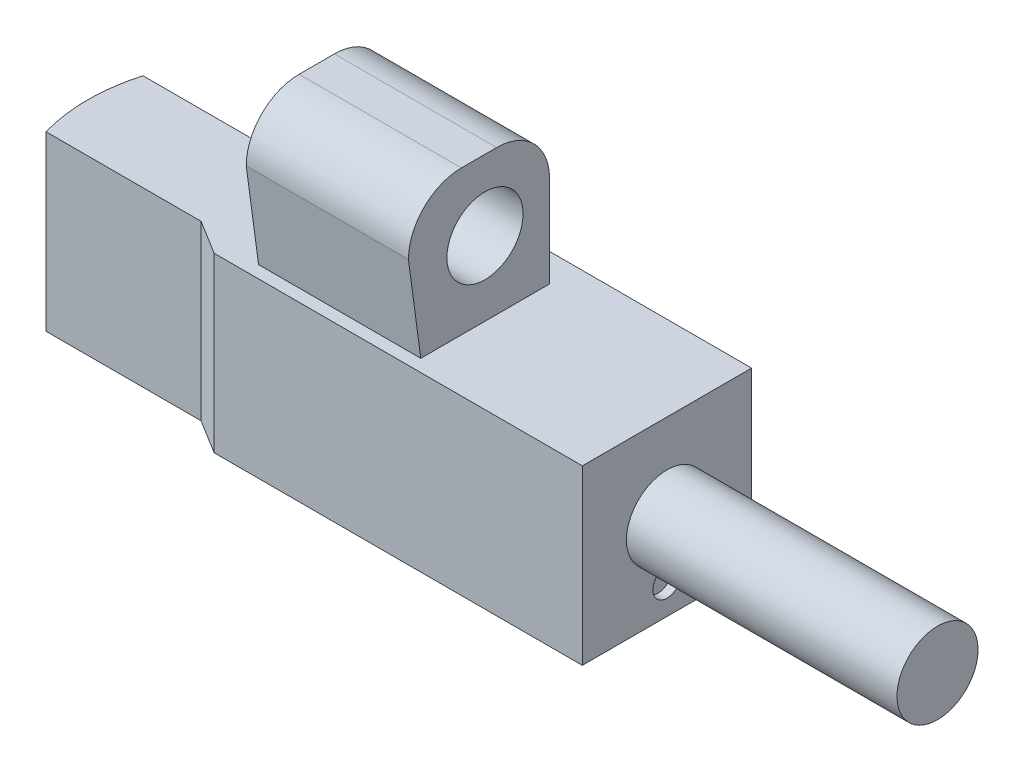
ISO-10303-21;
HEADER;
FILE_DESCRIPTION(('STEP AP214'),'2;1');
FILE_NAME('part.step','',(''),(''),'','','');
FILE_SCHEMA(('AUTOMOTIVE_DESIGN { 1 0 10303 214 1 1 1 1 }'));
ENDSEC;
DATA;
#1=APPLICATION_CONTEXT('core data for automotive mechanical design processes');
#2=APPLICATION_PROTOCOL_DEFINITION('international standard','automotive_design',2000,#1);
#3=PRODUCT_CONTEXT('',#1,'mechanical');
#4=PRODUCT('Part','Part','',(#3));
#5=PRODUCT_RELATED_PRODUCT_CATEGORY('part','',(#4));
#6=PRODUCT_DEFINITION_FORMATION('','',#4);
#7=PRODUCT_DEFINITION_CONTEXT('part definition',#1,'design');
#8=PRODUCT_DEFINITION('design','',#6,#7);
#9=PRODUCT_DEFINITION_SHAPE('','',#8);
#10=(LENGTH_UNIT() NAMED_UNIT(*) SI_UNIT(.MILLI.,.METRE.));
#11=(NAMED_UNIT(*) PLANE_ANGLE_UNIT() SI_UNIT($,.RADIAN.));
#12=(NAMED_UNIT(*) SI_UNIT($,.STERADIAN.) SOLID_ANGLE_UNIT());
#13=UNCERTAINTY_MEASURE_WITH_UNIT(LENGTH_MEASURE(1.E-05),#10,'distance_accuracy_value','');
#14=(GEOMETRIC_REPRESENTATION_CONTEXT(3) GLOBAL_UNCERTAINTY_ASSIGNED_CONTEXT((#13)) GLOBAL_UNIT_ASSIGNED_CONTEXT((#10,
#11,#12)) REPRESENTATION_CONTEXT('',''));
#15=CARTESIAN_POINT('',(0.,0.,0.));
#16=DIRECTION('',(0.,0.,1.));
#17=DIRECTION('',(1.,0.,0.));
#18=AXIS2_PLACEMENT_3D('',#15,#16,#17);
#19=CARTESIAN_POINT('',(7.87,5.95,0.23));
#20=DIRECTION('',(-1.,0.,0.));
#21=DIRECTION('',(0.,0.,1.));
#22=AXIS2_PLACEMENT_3D('',#19,#20,#21);
#23=PLANE('',#22);
#24=CARTESIAN_POINT('',(7.87,4.55,0.23));
#25=DIRECTION('',(-1.,0.,0.));
#26=DIRECTION('',(0.,0.,1.));
#27=AXIS2_PLACEMENT_3D('',#24,#25,#26);
#28=CIRCLE('',#27,1.08);
#29=CARTESIAN_POINT('',(7.87,4.55,1.31));
#30=VERTEX_POINT('',#29);
#31=EDGE_CURVE('E19',#30,#30,#28,.F.);
#32=ORIENTED_EDGE('',*,*,#31,.T.);
#33=EDGE_LOOP('',(#32));
#34=FACE_BOUND('',#33,.T.);
#35=CARTESIAN_POINT('',(7.87,4.55,0.23));
#36=DIRECTION('',(-1.,0.,0.));
#37=DIRECTION('',(0.,0.,1.));
#38=AXIS2_PLACEMENT_3D('',#35,#36,#37);
#39=CIRCLE('',#38,1.4);
#40=CARTESIAN_POINT('',(7.87,4.55,1.63));
#41=VERTEX_POINT('',#40);
#42=EDGE_CURVE('E96',#41,#41,#39,.T.);
#43=ORIENTED_EDGE('',*,*,#42,.T.);
#44=EDGE_LOOP('',(#43));
#45=FACE_BOUND('',#44,.T.);
#46=ADVANCED_FACE('F16',(#34,#45),#23,.T.);
#47=CARTESIAN_POINT('',(11.07,6.55,-0.1));
#48=DIRECTION('',(0.,-1.,0.));
#49=DIRECTION('',(0.,0.,-1.));
#50=AXIS2_PLACEMENT_3D('',#47,#48,#49);
#51=PLANE('',#50);
#52=DIRECTION('',(-1.,0.,0.));
#53=VECTOR('',#52,1.);
#54=CARTESIAN_POINT('',(11.07,6.55,0.9));
#55=LINE('',#54,#53);
#56=CARTESIAN_POINT('',(11.07,6.55,0.899999999999964));
#57=VERTEX_POINT('',#56);
#58=CARTESIAN_POINT('',(6.47,6.55,0.899999999999964));
#59=VERTEX_POINT('',#58);
#60=EDGE_CURVE('E91',#57,#59,#55,.T.);
#61=ORIENTED_EDGE('',*,*,#60,.F.);
#62=DIRECTION('',(0.,0.,-1.));
#63=VECTOR('',#62,1.);
#64=CARTESIAN_POINT('',(11.07,6.55,-0.1));
#65=LINE('',#64,#63);
#66=CARTESIAN_POINT('',(11.07,6.55,-0.0999999999999638));
#67=VERTEX_POINT('',#66);
#68=EDGE_CURVE('E76',#67,#57,#65,.F.);
#69=ORIENTED_EDGE('',*,*,#68,.F.);
#70=DIRECTION('',(-1.,0.,0.));
#71=VECTOR('',#70,1.);
#72=CARTESIAN_POINT('',(11.07,6.55,-0.1));
#73=LINE('',#72,#71);
#74=CARTESIAN_POINT('',(6.47,6.55,-0.0999999999999638));
#75=VERTEX_POINT('',#74);
#76=EDGE_CURVE('E101',#75,#67,#73,.F.);
#77=ORIENTED_EDGE('',*,*,#76,.F.);
#78=DIRECTION('',(0.,0.,-1.));
#79=VECTOR('',#78,1.);
#80=CARTESIAN_POINT('',(6.47,6.55,-0.1));
#81=LINE('',#80,#79);
#82=EDGE_CURVE('E88',#59,#75,#81,.T.);
#83=ORIENTED_EDGE('',*,*,#82,.F.);
#84=EDGE_LOOP('',(#61,#69,#77,#83));
#85=FACE_BOUND('',#84,.T.);
#86=ADVANCED_FACE('F92',(#85),#51,.F.);
#87=CARTESIAN_POINT('',(11.07,4.55,0.23));
#88=DIRECTION('',(-1.,0.,0.));
#89=DIRECTION('',(0.,0.,1.));
#90=AXIS2_PLACEMENT_3D('',#87,#88,#89);
#91=CYLINDRICAL_SURFACE('',#90,1.08);
#92=ORIENTED_EDGE('',*,*,#31,.F.);
#93=EDGE_LOOP('',(#92));
#94=FACE_BOUND('',#93,.T.);
#95=CARTESIAN_POINT('',(11.07,4.55,0.23));
#96=DIRECTION('',(-1.,0.,0.));
#97=DIRECTION('',(0.,0.,1.));
#98=AXIS2_PLACEMENT_3D('',#95,#96,#97);
#99=CIRCLE('',#98,1.08);
#100=CARTESIAN_POINT('',(11.07,4.55,1.31));
#101=VERTEX_POINT('',#100);
#102=EDGE_CURVE('E103',#101,#101,#99,.T.);
#103=ORIENTED_EDGE('',*,*,#102,.F.);
#104=EDGE_LOOP('',(#103));
#105=FACE_BOUND('',#104,.T.);
#106=ADVANCED_FACE('F526',(#94,#105),#91,.F.);
#107=CARTESIAN_POINT('',(11.07,5.04999999999993,0.899999999999929));
#108=DIRECTION('',(-1.,0.,0.));
#109=DIRECTION('',(0.,0.,1.));
#110=AXIS2_PLACEMENT_3D('',#107,#108,#109);
#111=CYLINDRICAL_SURFACE('',#110,1.50000000000007);
#112=CARTESIAN_POINT('',(11.07,5.04999999999993,0.899999999999929));
#113=DIRECTION('',(-1.,0.,0.));
#114=DIRECTION('',(0.,0.,1.));
#115=AXIS2_PLACEMENT_3D('',#112,#113,#114);
#116=CIRCLE('',#115,1.50000000000007);
#117=CARTESIAN_POINT('',(11.07,5.05,2.4));
#118=VERTEX_POINT('',#117);
#119=EDGE_CURVE('E81',#57,#118,#116,.F.);
#120=ORIENTED_EDGE('',*,*,#119,.F.);
#121=ORIENTED_EDGE('',*,*,#60,.T.);
#122=CARTESIAN_POINT('',(6.47,5.04999999999993,0.899999999999929));
#123=DIRECTION('',(-1.,0.,0.));
#124=DIRECTION('',(0.,0.,1.));
#125=AXIS2_PLACEMENT_3D('',#122,#123,#124);
#126=CIRCLE('',#125,1.50000000000007);
#127=CARTESIAN_POINT('',(6.47,5.05,2.4));
#128=VERTEX_POINT('',#127);
#129=EDGE_CURVE('E121',#59,#128,#126,.F.);
#130=ORIENTED_EDGE('',*,*,#129,.T.);
#131=DIRECTION('',(1.,0.,0.));
#132=VECTOR('',#131,1.);
#133=CARTESIAN_POINT('',(11.07,5.05,2.4));
#134=LINE('',#133,#132);
#135=EDGE_CURVE('E100',#128,#118,#134,.T.);
#136=ORIENTED_EDGE('',*,*,#135,.T.);
#137=EDGE_LOOP('',(#120,#121,#130,#136));
#138=FACE_BOUND('',#137,.T.);
#139=ADVANCED_FACE('F99',(#138),#111,.T.);
#140=CARTESIAN_POINT('',(11.07,4.55,0.23));
#141=DIRECTION('',(-1.,0.,0.));
#142=DIRECTION('',(0.,0.,1.));
#143=AXIS2_PLACEMENT_3D('',#140,#141,#142);
#144=CYLINDRICAL_SURFACE('',#143,1.4);
#145=ORIENTED_EDGE('',*,*,#42,.F.);
#146=EDGE_LOOP('',(#145));
#147=FACE_BOUND('',#146,.T.);
#148=CARTESIAN_POINT('',(6.47,4.55,0.23));
#149=DIRECTION('',(-1.,0.,0.));
#150=DIRECTION('',(0.,0.,1.));
#151=AXIS2_PLACEMENT_3D('',#148,#149,#150);
#152=CIRCLE('',#151,1.4);
#153=CARTESIAN_POINT('',(6.47,4.55,1.63));
#154=VERTEX_POINT('',#153);
#155=EDGE_CURVE('E118',#154,#154,#152,.T.);
#156=ORIENTED_EDGE('',*,*,#155,.T.);
#157=EDGE_LOOP('',(#156));
#158=FACE_BOUND('',#157,.T.);
#159=ADVANCED_FACE('F111',(#147,#158),#144,.F.);
#160=CARTESIAN_POINT('',(11.07,5.04999999999993,-0.0999999999999274));
#161=DIRECTION('',(-1.,0.,0.));
#162=DIRECTION('',(0.,0.,1.));
#163=AXIS2_PLACEMENT_3D('',#160,#161,#162);
#164=CYLINDRICAL_SURFACE('',#163,1.50000000000007);
#165=CARTESIAN_POINT('',(11.07,5.04999999999993,-0.0999999999999274));
#166=DIRECTION('',(-1.,0.,0.));
#167=DIRECTION('',(0.,0.,1.));
#168=AXIS2_PLACEMENT_3D('',#165,#166,#167);
#169=CIRCLE('',#168,1.50000000000007);
#170=CARTESIAN_POINT('',(11.07,5.04999999999993,-1.6));
#171=VERTEX_POINT('',#170);
#172=EDGE_CURVE('E84',#171,#67,#169,.F.);
#173=ORIENTED_EDGE('',*,*,#172,.F.);
#174=DIRECTION('',(1.,0.,0.));
#175=VECTOR('',#174,1.);
#176=CARTESIAN_POINT('',(11.07,5.04999999999993,-1.6));
#177=LINE('',#176,#175);
#178=CARTESIAN_POINT('',(6.47,5.04999999999993,-1.6));
#179=VERTEX_POINT('',#178);
#180=EDGE_CURVE('E123',#171,#179,#177,.F.);
#181=ORIENTED_EDGE('',*,*,#180,.T.);
#182=CARTESIAN_POINT('',(6.47,5.04999999999993,-0.0999999999999274));
#183=DIRECTION('',(-1.,0.,0.));
#184=DIRECTION('',(0.,0.,1.));
#185=AXIS2_PLACEMENT_3D('',#182,#183,#184);
#186=CIRCLE('',#185,1.50000000000007);
#187=EDGE_CURVE('E125',#179,#75,#186,.F.);
#188=ORIENTED_EDGE('',*,*,#187,.T.);
#189=ORIENTED_EDGE('',*,*,#76,.T.);
#190=EDGE_LOOP('',(#173,#181,#188,#189));
#191=FACE_BOUND('',#190,.T.);
#192=ADVANCED_FACE('F114',(#191),#164,.T.);
#193=CARTESIAN_POINT('',(15.75,-1.6,0.));
#194=DIRECTION('',(1.,0.,0.));
#195=DIRECTION('',(0.,0.,-1.));
#196=AXIS2_PLACEMENT_3D('',#193,#194,#195);
#197=PLANE('',#196);
#198=CARTESIAN_POINT('',(15.75,-1.6,0.));
#199=DIRECTION('',(1.,0.,0.));
#200=DIRECTION('',(0.,0.,-1.));
#201=AXIS2_PLACEMENT_3D('',#198,#199,#200);
#202=CIRCLE('',#201,0.4);
#203=CARTESIAN_POINT('',(15.75,-1.6,-0.4));
#204=VERTEX_POINT('',#203);
#205=EDGE_CURVE('E128',#204,#204,#202,.T.);
#206=ORIENTED_EDGE('',*,*,#205,.T.);
#207=EDGE_LOOP('',(#206));
#208=FACE_BOUND('',#207,.T.);
#209=ADVANCED_FACE('F497',(#208),#197,.T.);
#210=CARTESIAN_POINT('',(23.6711556437292,1.15,0.));
#211=DIRECTION('',(-1.,0.,0.));
#212=DIRECTION('',(0.,0.,1.));
#213=AXIS2_PLACEMENT_3D('',#210,#211,#212);
#214=PLANE('',#213);
#215=CARTESIAN_POINT('',(23.6711556437292,0.,0.));
#216=DIRECTION('',(-1.,0.,0.));
#217=DIRECTION('',(0.,0.,1.));
#218=AXIS2_PLACEMENT_3D('',#215,#216,#217);
#219=CIRCLE('',#218,1.15);
#220=CARTESIAN_POINT('',(23.6711556437292,0.,1.15));
#221=VERTEX_POINT('',#220);
#222=EDGE_CURVE('E163',#221,#221,#219,.T.);
#223=ORIENTED_EDGE('',*,*,#222,.F.);
#224=EDGE_LOOP('',(#223));
#225=FACE_BOUND('',#224,.T.);
#226=ADVANCED_FACE('F489',(#225),#214,.F.);
#227=CARTESIAN_POINT('',(11.07,5.04999999999993,0.899999999999929));
#228=DIRECTION('',(1.,0.,0.));
#229=DIRECTION('',(0.,0.,-1.));
#230=AXIS2_PLACEMENT_3D('',#227,#228,#229);
#231=PLANE('',#230);
#232=ORIENTED_EDGE('',*,*,#102,.T.);
#233=EDGE_LOOP('',(#232));
#234=FACE_BOUND('',#233,.T.);
#235=ORIENTED_EDGE('',*,*,#172,.T.);
#236=ORIENTED_EDGE('',*,*,#68,.T.);
#237=ORIENTED_EDGE('',*,*,#119,.T.);
#238=DIRECTION('',(0.,0.991060661622863,0.133412012141539));
#239=VECTOR('',#238,1.);
#240=CARTESIAN_POINT('',(11.07,5.05,2.4));
#241=LINE('',#240,#239);
#242=CARTESIAN_POINT('',(11.07,2.45,2.05));
#243=VERTEX_POINT('',#242);
#244=EDGE_CURVE('E136',#118,#243,#241,.F.);
#245=ORIENTED_EDGE('',*,*,#244,.T.);
#246=DIRECTION('',(0.,0.,1.));
#247=VECTOR('',#246,1.);
#248=CARTESIAN_POINT('',(11.07,2.45,0.425));
#249=LINE('',#248,#247);
#250=CARTESIAN_POINT('',(11.07,2.45,-1.6));
#251=VERTEX_POINT('',#250);
#252=EDGE_CURVE('E144',#251,#243,#249,.T.);
#253=ORIENTED_EDGE('',*,*,#252,.F.);
#254=DIRECTION('',(0.,1.,0.));
#255=VECTOR('',#254,1.);
#256=CARTESIAN_POINT('',(11.07,2.45,-1.6));
#257=LINE('',#256,#255);
#258=EDGE_CURVE('E120',#251,#171,#257,.T.);
#259=ORIENTED_EDGE('',*,*,#258,.T.);
#260=EDGE_LOOP('',(#235,#236,#237,#245,#253,#259));
#261=FACE_BOUND('',#260,.T.);
#262=ADVANCED_FACE('F78',(#234,#261),#231,.T.);
#263=CARTESIAN_POINT('',(11.07,5.05,2.4));
#264=DIRECTION('',(0.,0.133412012141539,-0.991060661622863));
#265=DIRECTION('',(0.,0.991060661622863,0.133412012141539));
#266=AXIS2_PLACEMENT_3D('',#263,#264,#265);
#267=PLANE('',#266);
#268=DIRECTION('',(1.,0.,0.));
#269=VECTOR('',#268,1.);
#270=CARTESIAN_POINT('',(4.99999999999997,2.45,2.05));
#271=LINE('',#270,#269);
#272=CARTESIAN_POINT('',(6.47,2.45,2.05));
#273=VERTEX_POINT('',#272);
#274=EDGE_CURVE('E140',#243,#273,#271,.F.);
#275=ORIENTED_EDGE('',*,*,#274,.F.);
#276=ORIENTED_EDGE('',*,*,#244,.F.);
#277=ORIENTED_EDGE('',*,*,#135,.F.);
#278=DIRECTION('',(0.,-0.991060661622862,-0.133412012141539));
#279=VECTOR('',#278,1.);
#280=CARTESIAN_POINT('',(6.47,5.05,2.4));
#281=LINE('',#280,#279);
#282=EDGE_CURVE('E132',#128,#273,#281,.T.);
#283=ORIENTED_EDGE('',*,*,#282,.T.);
#284=EDGE_LOOP('',(#275,#276,#277,#283));
#285=FACE_BOUND('',#284,.T.);
#286=ADVANCED_FACE('F227',(#285),#267,.F.);
#287=CARTESIAN_POINT('',(6.47,5.04999999999993,0.899999999999929));
#288=DIRECTION('',(1.,0.,0.));
#289=DIRECTION('',(0.,0.,-1.));
#290=AXIS2_PLACEMENT_3D('',#287,#288,#289);
#291=PLANE('',#290);
#292=ORIENTED_EDGE('',*,*,#155,.F.);
#293=EDGE_LOOP('',(#292));
#294=FACE_BOUND('',#293,.T.);
#295=ORIENTED_EDGE('',*,*,#82,.T.);
#296=ORIENTED_EDGE('',*,*,#187,.F.);
#297=DIRECTION('',(0.,1.,0.));
#298=VECTOR('',#297,1.);
#299=CARTESIAN_POINT('',(6.47,2.45,-1.6));
#300=LINE('',#299,#298);
#301=CARTESIAN_POINT('',(6.47,2.45,-1.6));
#302=VERTEX_POINT('',#301);
#303=EDGE_CURVE('E174',#179,#302,#300,.F.);
#304=ORIENTED_EDGE('',*,*,#303,.T.);
#305=DIRECTION('',(0.,0.,1.));
#306=VECTOR('',#305,1.);
#307=CARTESIAN_POINT('',(6.47,2.45,0.425));
#308=LINE('',#307,#306);
#309=EDGE_CURVE('E143',#273,#302,#308,.F.);
#310=ORIENTED_EDGE('',*,*,#309,.F.);
#311=ORIENTED_EDGE('',*,*,#282,.F.);
#312=ORIENTED_EDGE('',*,*,#129,.F.);
#313=EDGE_LOOP('',(#295,#296,#304,#310,#311,#312));
#314=FACE_BOUND('',#313,.T.);
#315=ADVANCED_FACE('F467',(#294,#314),#291,.F.);
#316=CARTESIAN_POINT('',(11.07,2.45,-1.6));
#317=DIRECTION('',(0.,0.,1.));
#318=DIRECTION('',(1.,0.,0.));
#319=AXIS2_PLACEMENT_3D('',#316,#317,#318);
#320=PLANE('',#319);
#321=ORIENTED_EDGE('',*,*,#180,.F.);
#322=ORIENTED_EDGE('',*,*,#258,.F.);
#323=DIRECTION('',(1.,0.,0.));
#324=VECTOR('',#323,1.);
#325=CARTESIAN_POINT('',(4.99999999999997,2.45,-1.6));
#326=LINE('',#325,#324);
#327=EDGE_CURVE('E192',#302,#251,#326,.T.);
#328=ORIENTED_EDGE('',*,*,#327,.F.);
#329=ORIENTED_EDGE('',*,*,#303,.F.);
#330=EDGE_LOOP('',(#321,#322,#328,#329));
#331=FACE_BOUND('',#330,.T.);
#332=ADVANCED_FACE('F357',(#331),#320,.F.);
#333=CARTESIAN_POINT('',(4.59,2.45,1.8));
#334=DIRECTION('',(0.526052747907819,0.,-0.850451942450973));
#335=DIRECTION('',(-0.850451942450973,0.,-0.526052747907819));
#336=AXIS2_PLACEMENT_3D('',#333,#334,#335);
#337=PLANE('',#336);
#338=DIRECTION('',(-0.850451942450973,0.,-0.526052747907819));
#339=VECTOR('',#338,1.);
#340=CARTESIAN_POINT('',(4.59,-2.45,1.8));
#341=LINE('',#340,#339);
#342=CARTESIAN_POINT('',(5.56,-2.45,2.4));
#343=VERTEX_POINT('',#342);
#344=CARTESIAN_POINT('',(4.59,-2.45,1.8));
#345=VERTEX_POINT('',#344);
#346=EDGE_CURVE('E170',#343,#345,#341,.T.);
#347=ORIENTED_EDGE('',*,*,#346,.F.);
#348=DIRECTION('',(0.,1.,0.));
#349=VECTOR('',#348,1.);
#350=CARTESIAN_POINT('',(5.56,2.45,2.4));
#351=LINE('',#350,#349);
#352=CARTESIAN_POINT('',(5.56,2.45,2.4));
#353=VERTEX_POINT('',#352);
#354=EDGE_CURVE('E162',#343,#353,#351,.T.);
#355=ORIENTED_EDGE('',*,*,#354,.T.);
#356=DIRECTION('',(0.850451942450973,0.,0.526052747907819));
#357=VECTOR('',#356,1.);
#358=CARTESIAN_POINT('',(4.59,2.45,1.8));
#359=LINE('',#358,#357);
#360=CARTESIAN_POINT('',(4.59,2.45,1.8));
#361=VERTEX_POINT('',#360);
#362=EDGE_CURVE('E188',#361,#353,#359,.T.);
#363=ORIENTED_EDGE('',*,*,#362,.F.);
#364=DIRECTION('',(0.,1.,0.));
#365=VECTOR('',#364,1.);
#366=CARTESIAN_POINT('',(4.59,2.45,1.8));
#367=LINE('',#366,#365);
#368=EDGE_CURVE('E310',#361,#345,#367,.F.);
#369=ORIENTED_EDGE('',*,*,#368,.T.);
#370=EDGE_LOOP('',(#347,#355,#363,#369));
#371=FACE_BOUND('',#370,.T.);
#372=ADVANCED_FACE('F348',(#371),#337,.F.);
#373=CARTESIAN_POINT('',(15.75,-1.6,0.));
#374=DIRECTION('',(1.,0.,0.));
#375=DIRECTION('',(0.,0.,-1.));
#376=AXIS2_PLACEMENT_3D('',#373,#374,#375);
#377=CYLINDRICAL_SURFACE('',#376,0.4);
#378=ORIENTED_EDGE('',*,*,#205,.F.);
#379=EDGE_LOOP('',(#378));
#380=FACE_BOUND('',#379,.T.);
#381=CARTESIAN_POINT('',(16.,-1.6,0.));
#382=DIRECTION('',(1.,0.,0.));
#383=DIRECTION('',(0.,0.,-1.));
#384=AXIS2_PLACEMENT_3D('',#381,#382,#383);
#385=CIRCLE('',#384,0.4);
#386=CARTESIAN_POINT('',(16.,-1.6,-0.4));
#387=VERTEX_POINT('',#386);
#388=EDGE_CURVE('E159',#387,#387,#385,.T.);
#389=ORIENTED_EDGE('',*,*,#388,.T.);
#390=EDGE_LOOP('',(#389));
#391=FACE_BOUND('',#390,.T.);
#392=ADVANCED_FACE('F345',(#380,#391),#377,.F.);
#393=CARTESIAN_POINT('',(23.6711556437292,0.,0.));
#394=DIRECTION('',(-1.,0.,0.));
#395=DIRECTION('',(0.,0.,1.));
#396=AXIS2_PLACEMENT_3D('',#393,#394,#395);
#397=CYLINDRICAL_SURFACE('',#396,1.15);
#398=ORIENTED_EDGE('',*,*,#222,.T.);
#399=EDGE_LOOP('',(#398));
#400=FACE_BOUND('',#399,.T.);
#401=CARTESIAN_POINT('',(16.,0.,0.));
#402=DIRECTION('',(-1.,0.,0.));
#403=DIRECTION('',(0.,0.,1.));
#404=AXIS2_PLACEMENT_3D('',#401,#402,#403);
#405=CIRCLE('',#404,1.15);
#406=CARTESIAN_POINT('',(16.,0.,1.15));
#407=VERTEX_POINT('',#406);
#408=EDGE_CURVE('E154',#407,#407,#405,.F.);
#409=ORIENTED_EDGE('',*,*,#408,.T.);
#410=EDGE_LOOP('',(#409));
#411=FACE_BOUND('',#410,.T.);
#412=ADVANCED_FACE('F347',(#400,#411),#397,.T.);
#413=CARTESIAN_POINT('',(4.99999999999997,2.45,0.425));
#414=DIRECTION('',(0.,1.,0.));
#415=DIRECTION('',(0.,0.,1.));
#416=AXIS2_PLACEMENT_3D('',#413,#414,#415);
#417=PLANE('',#416);
#418=DIRECTION('',(0.800989824231255,0.,-0.598677961409958));
#419=VECTOR('',#418,1.);
#420=CARTESIAN_POINT('',(6.53,2.45,-2.4));
#421=LINE('',#420,#419);
#422=CARTESIAN_POINT('',(6.53,2.45,-2.4));
#423=VERTEX_POINT('',#422);
#424=CARTESIAN_POINT('',(4.59,2.45,-0.95));
#425=VERTEX_POINT('',#424);
#426=EDGE_CURVE('E266',#423,#425,#421,.F.);
#427=ORIENTED_EDGE('',*,*,#426,.T.);
#428=DIRECTION('',(1.,0.,0.));
#429=VECTOR('',#428,1.);
#430=CARTESIAN_POINT('',(4.59,2.45,-0.95));
#431=LINE('',#430,#429);
#432=CARTESIAN_POINT('',(0.192778869242651,2.45,-0.949999999999999));
#433=VERTEX_POINT('',#432);
#434=EDGE_CURVE('E270',#425,#433,#431,.F.);
#435=ORIENTED_EDGE('',*,*,#434,.T.);
#436=CARTESIAN_POINT('',(4.99999999999997,2.45,0.425));
#437=DIRECTION('',(0.,-1.,0.));
#438=DIRECTION('',(0.,0.,-1.));
#439=AXIS2_PLACEMENT_3D('',#436,#437,#438);
#440=CIRCLE('',#439,4.99999999999996);
#441=CARTESIAN_POINT('',(0.192778869242651,2.45,1.8));
#442=VERTEX_POINT('',#441);
#443=EDGE_CURVE('E150',#442,#433,#440,.T.);
#444=ORIENTED_EDGE('',*,*,#443,.F.);
#445=DIRECTION('',(-1.,0.,0.));
#446=VECTOR('',#445,1.);
#447=CARTESIAN_POINT('',(0.19277886924265,2.45,1.8));
#448=LINE('',#447,#446);
#449=EDGE_CURVE('E191',#442,#361,#448,.F.);
#450=ORIENTED_EDGE('',*,*,#449,.T.);
#451=ORIENTED_EDGE('',*,*,#362,.T.);
#452=DIRECTION('',(-1.,0.,0.));
#453=VECTOR('',#452,1.);
#454=CARTESIAN_POINT('',(5.56,2.45,2.4));
#455=LINE('',#454,#453);
#456=CARTESIAN_POINT('',(16.,2.45,2.4));
#457=VERTEX_POINT('',#456);
#458=EDGE_CURVE('E307',#353,#457,#455,.F.);
#459=ORIENTED_EDGE('',*,*,#458,.T.);
#460=DIRECTION('',(0.,0.,1.));
#461=VECTOR('',#460,1.);
#462=CARTESIAN_POINT('',(16.,2.45,2.4));
#463=LINE('',#462,#461);
#464=CARTESIAN_POINT('',(16.,2.45,-2.4));
#465=VERTEX_POINT('',#464);
#466=EDGE_CURVE('E161',#457,#465,#463,.F.);
#467=ORIENTED_EDGE('',*,*,#466,.T.);
#468=DIRECTION('',(1.,0.,0.));
#469=VECTOR('',#468,1.);
#470=CARTESIAN_POINT('',(16.,2.45,-2.4));
#471=LINE('',#470,#469);
#472=EDGE_CURVE('E157',#465,#423,#471,.F.);
#473=ORIENTED_EDGE('',*,*,#472,.T.);
#474=EDGE_LOOP('',(#427,#435,#444,#450,#451,#459,#467,#473));
#475=FACE_BOUND('',#474,.T.);
#476=ORIENTED_EDGE('',*,*,#309,.T.);
#477=ORIENTED_EDGE('',*,*,#327,.T.);
#478=ORIENTED_EDGE('',*,*,#252,.T.);
#479=ORIENTED_EDGE('',*,*,#274,.T.);
#480=EDGE_LOOP('',(#476,#477,#478,#479));
#481=FACE_BOUND('',#480,.T.);
#482=ADVANCED_FACE('F217',(#475,#481),#417,.T.);
#483=CARTESIAN_POINT('',(0.19277886924265,2.45,1.8));
#484=DIRECTION('',(0.,0.,-1.));
#485=DIRECTION('',(-1.,0.,0.));
#486=AXIS2_PLACEMENT_3D('',#483,#484,#485);
#487=PLANE('',#486);
#488=DIRECTION('',(1.,0.,0.));
#489=VECTOR('',#488,1.);
#490=CARTESIAN_POINT('',(4.99999999999997,-2.45,1.8));
#491=LINE('',#490,#489);
#492=CARTESIAN_POINT('',(0.192778869242651,-2.45,1.8));
#493=VERTEX_POINT('',#492);
#494=EDGE_CURVE('E152',#493,#345,#491,.T.);
#495=ORIENTED_EDGE('',*,*,#494,.T.);
#496=ORIENTED_EDGE('',*,*,#368,.F.);
#497=ORIENTED_EDGE('',*,*,#449,.F.);
#498=DIRECTION('',(0.,-1.,0.));
#499=VECTOR('',#498,1.);
#500=CARTESIAN_POINT('',(0.19277886924265,2.45,1.8));
#501=LINE('',#500,#499);
#502=EDGE_CURVE('E153',#493,#442,#501,.F.);
#503=ORIENTED_EDGE('',*,*,#502,.F.);
#504=EDGE_LOOP('',(#495,#496,#497,#503));
#505=FACE_BOUND('',#504,.T.);
#506=ADVANCED_FACE('F378',(#505),#487,.F.);
#507=CARTESIAN_POINT('',(5.56,2.45,2.4));
#508=DIRECTION('',(0.,0.,-1.));
#509=DIRECTION('',(-1.,0.,0.));
#510=AXIS2_PLACEMENT_3D('',#507,#508,#509);
#511=PLANE('',#510);
#512=DIRECTION('',(1.,0.,0.));
#513=VECTOR('',#512,1.);
#514=CARTESIAN_POINT('',(4.99999999999997,-2.45,2.4));
#515=LINE('',#514,#513);
#516=CARTESIAN_POINT('',(16.,-2.45,2.4));
#517=VERTEX_POINT('',#516);
#518=EDGE_CURVE('E285',#343,#517,#515,.T.);
#519=ORIENTED_EDGE('',*,*,#518,.T.);
#520=DIRECTION('',(0.,1.,0.));
#521=VECTOR('',#520,1.);
#522=CARTESIAN_POINT('',(16.,2.45,2.4));
#523=LINE('',#522,#521);
#524=EDGE_CURVE('E158',#517,#457,#523,.T.);
#525=ORIENTED_EDGE('',*,*,#524,.T.);
#526=ORIENTED_EDGE('',*,*,#458,.F.);
#527=ORIENTED_EDGE('',*,*,#354,.F.);
#528=EDGE_LOOP('',(#519,#525,#526,#527));
#529=FACE_BOUND('',#528,.T.);
#530=ADVANCED_FACE('F336',(#529),#511,.F.);
#531=CARTESIAN_POINT('',(16.,2.45,2.4));
#532=DIRECTION('',(-1.,0.,0.));
#533=DIRECTION('',(0.,0.,1.));
#534=AXIS2_PLACEMENT_3D('',#531,#532,#533);
#535=PLANE('',#534);
#536=ORIENTED_EDGE('',*,*,#408,.F.);
#537=EDGE_LOOP('',(#536));
#538=FACE_BOUND('',#537,.T.);
#539=DIRECTION('',(0.,0.,1.));
#540=VECTOR('',#539,1.);
#541=CARTESIAN_POINT('',(16.,-2.45,0.425));
#542=LINE('',#541,#540);
#543=CARTESIAN_POINT('',(16.,-2.45,-2.4));
#544=VERTEX_POINT('',#543);
#545=EDGE_CURVE('E283',#517,#544,#542,.F.);
#546=ORIENTED_EDGE('',*,*,#545,.T.);
#547=DIRECTION('',(0.,1.,0.));
#548=VECTOR('',#547,1.);
#549=CARTESIAN_POINT('',(16.,2.45,-2.4));
#550=LINE('',#549,#548);
#551=EDGE_CURVE('E282',#544,#465,#550,.T.);
#552=ORIENTED_EDGE('',*,*,#551,.T.);
#553=ORIENTED_EDGE('',*,*,#466,.F.);
#554=ORIENTED_EDGE('',*,*,#524,.F.);
#555=EDGE_LOOP('',(#546,#552,#553,#554));
#556=FACE_BOUND('',#555,.T.);
#557=ORIENTED_EDGE('',*,*,#388,.F.);
#558=EDGE_LOOP('',(#557));
#559=FACE_BOUND('',#558,.T.);
#560=ADVANCED_FACE('F338',(#538,#556,#559),#535,.F.);
#561=CARTESIAN_POINT('',(16.,2.45,-2.4));
#562=DIRECTION('',(0.,0.,1.));
#563=DIRECTION('',(1.,0.,0.));
#564=AXIS2_PLACEMENT_3D('',#561,#562,#563);
#565=PLANE('',#564);
#566=DIRECTION('',(1.,0.,0.));
#567=VECTOR('',#566,1.);
#568=CARTESIAN_POINT('',(4.99999999999997,-2.45,-2.4));
#569=LINE('',#568,#567);
#570=CARTESIAN_POINT('',(6.53,-2.45,-2.4));
#571=VERTEX_POINT('',#570);
#572=EDGE_CURVE('E276',#544,#571,#569,.F.);
#573=ORIENTED_EDGE('',*,*,#572,.T.);
#574=DIRECTION('',(0.,1.,0.));
#575=VECTOR('',#574,1.);
#576=CARTESIAN_POINT('',(6.53,2.45,-2.4));
#577=LINE('',#576,#575);
#578=EDGE_CURVE('E260',#571,#423,#577,.T.);
#579=ORIENTED_EDGE('',*,*,#578,.T.);
#580=ORIENTED_EDGE('',*,*,#472,.F.);
#581=ORIENTED_EDGE('',*,*,#551,.F.);
#582=EDGE_LOOP('',(#573,#579,#580,#581));
#583=FACE_BOUND('',#582,.T.);
#584=ADVANCED_FACE('F280',(#583),#565,.F.);
#585=CARTESIAN_POINT('',(6.53,2.45,-2.4));
#586=DIRECTION('',(0.598677961409958,0.,0.800989824231255));
#587=DIRECTION('',(0.800989824231255,0.,-0.598677961409958));
#588=AXIS2_PLACEMENT_3D('',#585,#586,#587);
#589=PLANE('',#588);
#590=DIRECTION('',(-0.800989824231255,0.,0.598677961409959));
#591=VECTOR('',#590,1.);
#592=CARTESIAN_POINT('',(6.53,-2.45,-2.4));
#593=LINE('',#592,#591);
#594=CARTESIAN_POINT('',(4.59,-2.45,-0.95));
#595=VERTEX_POINT('',#594);
#596=EDGE_CURVE('E264',#571,#595,#593,.T.);
#597=ORIENTED_EDGE('',*,*,#596,.T.);
#598=DIRECTION('',(0.,1.,0.));
#599=VECTOR('',#598,1.);
#600=CARTESIAN_POINT('',(4.59,2.45,-0.95));
#601=LINE('',#600,#599);
#602=EDGE_CURVE('E319',#595,#425,#601,.T.);
#603=ORIENTED_EDGE('',*,*,#602,.T.);
#604=ORIENTED_EDGE('',*,*,#426,.F.);
#605=ORIENTED_EDGE('',*,*,#578,.F.);
#606=EDGE_LOOP('',(#597,#603,#604,#605));
#607=FACE_BOUND('',#606,.T.);
#608=ADVANCED_FACE('F262',(#607),#589,.F.);
#609=CARTESIAN_POINT('',(4.59,2.45,-0.95));
#610=DIRECTION('',(0.,0.,1.));
#611=DIRECTION('',(1.,0.,0.));
#612=AXIS2_PLACEMENT_3D('',#609,#610,#611);
#613=PLANE('',#612);
#614=DIRECTION('',(1.,0.,0.));
#615=VECTOR('',#614,1.);
#616=CARTESIAN_POINT('',(4.99999999999997,-2.45,-0.95));
#617=LINE('',#616,#615);
#618=CARTESIAN_POINT('',(0.192778869242651,-2.45,-0.949999999999999));
#619=VERTEX_POINT('',#618);
#620=EDGE_CURVE('E25',#595,#619,#617,.F.);
#621=ORIENTED_EDGE('',*,*,#620,.T.);
#622=DIRECTION('',(0.,-1.,0.));
#623=VECTOR('',#622,1.);
#624=CARTESIAN_POINT('',(0.19277886924265,2.45,-0.949999999999999));
#625=LINE('',#624,#623);
#626=EDGE_CURVE('E33',#433,#619,#625,.T.);
#627=ORIENTED_EDGE('',*,*,#626,.F.);
#628=ORIENTED_EDGE('',*,*,#434,.F.);
#629=ORIENTED_EDGE('',*,*,#602,.F.);
#630=EDGE_LOOP('',(#621,#627,#628,#629));
#631=FACE_BOUND('',#630,.T.);
#632=ADVANCED_FACE('F366',(#631),#613,.F.);
#633=CARTESIAN_POINT('',(4.99999999999997,2.45,0.425));
#634=DIRECTION('',(0.,-1.,0.));
#635=DIRECTION('',(0.,0.,-1.));
#636=AXIS2_PLACEMENT_3D('',#633,#634,#635);
#637=CYLINDRICAL_SURFACE('',#636,4.99999999999996);
#638=ORIENTED_EDGE('',*,*,#502,.T.);
#639=ORIENTED_EDGE('',*,*,#443,.T.);
#640=ORIENTED_EDGE('',*,*,#626,.T.);
#641=CARTESIAN_POINT('',(4.99999999999997,-2.45,0.425));
#642=DIRECTION('',(0.,-1.,0.));
#643=DIRECTION('',(0.,0.,-1.));
#644=AXIS2_PLACEMENT_3D('',#641,#642,#643);
#645=CIRCLE('',#644,4.99999999999996);
#646=EDGE_CURVE('E11',#619,#493,#645,.F.);
#647=ORIENTED_EDGE('',*,*,#646,.T.);
#648=EDGE_LOOP('',(#638,#639,#640,#647));
#649=FACE_BOUND('',#648,.T.);
#650=ADVANCED_FACE('F361',(#649),#637,.T.);
#651=CARTESIAN_POINT('',(4.99999999999997,-2.45,0.425));
#652=DIRECTION('',(0.,1.,0.));
#653=DIRECTION('',(0.,0.,1.));
#654=AXIS2_PLACEMENT_3D('',#651,#652,#653);
#655=PLANE('',#654);
#656=ORIENTED_EDGE('',*,*,#620,.F.);
#657=ORIENTED_EDGE('',*,*,#596,.F.);
#658=ORIENTED_EDGE('',*,*,#572,.F.);
#659=ORIENTED_EDGE('',*,*,#545,.F.);
#660=ORIENTED_EDGE('',*,*,#518,.F.);
#661=ORIENTED_EDGE('',*,*,#346,.T.);
#662=ORIENTED_EDGE('',*,*,#494,.F.);
#663=ORIENTED_EDGE('',*,*,#646,.F.);
#664=EDGE_LOOP('',(#656,#657,#658,#659,#660,#661,#662,#663));
#665=FACE_BOUND('',#664,.T.);
#666=ADVANCED_FACE('F274',(#665),#655,.F.);
#667=CLOSED_SHELL('',(#46,#86,#106,#139,#159,#192,#209,#226,#262,#286,#315,#332,#372,#392,#412,
#482,#506,#530,#560,#584,#608,#632,#650,#666));
#668=MANIFOLD_SOLID_BREP('B1',#667);
#669=ADVANCED_BREP_SHAPE_REPRESENTATION('',(#18,#668),#14);
#670=SHAPE_DEFINITION_REPRESENTATION(#9,#669);
ENDSEC;
END-ISO-10303-21;
